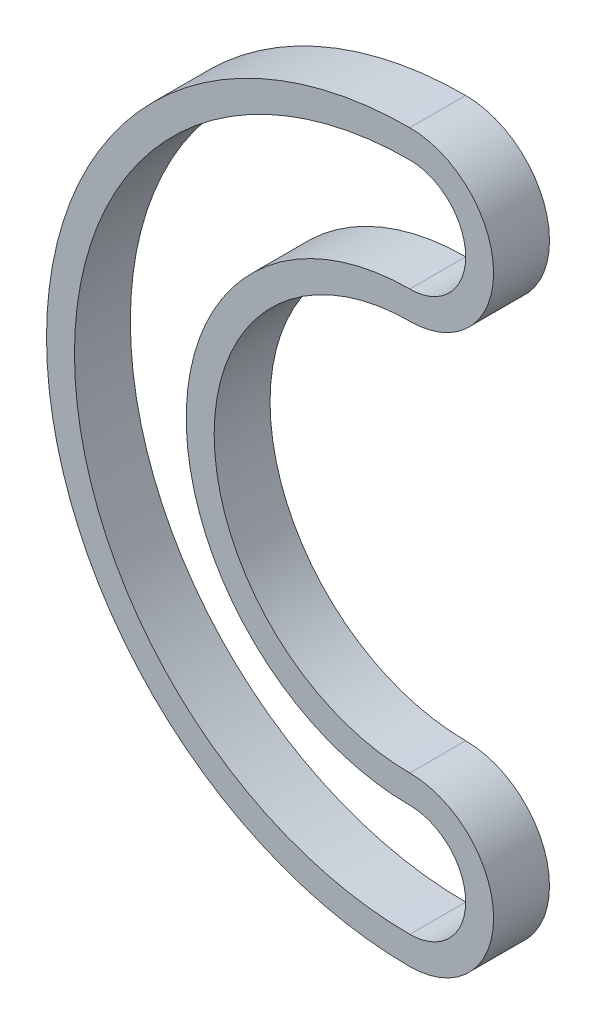
ISO-10303-21;
HEADER;
FILE_DESCRIPTION(('STEP AP214'),'2;1');
FILE_NAME('part.step','',(''),(''),'','','');
FILE_SCHEMA(('AUTOMOTIVE_DESIGN { 1 0 10303 214 1 1 1 1 }'));
ENDSEC;
DATA;
#1=APPLICATION_CONTEXT('core data for automotive mechanical design processes');
#2=APPLICATION_PROTOCOL_DEFINITION('international standard','automotive_design',2000,#1);
#3=PRODUCT_CONTEXT('',#1,'mechanical');
#4=PRODUCT('Part','Part','',(#3));
#5=PRODUCT_RELATED_PRODUCT_CATEGORY('part','',(#4));
#6=PRODUCT_DEFINITION_FORMATION('','',#4);
#7=PRODUCT_DEFINITION_CONTEXT('part definition',#1,'design');
#8=PRODUCT_DEFINITION('design','',#6,#7);
#9=PRODUCT_DEFINITION_SHAPE('','',#8);
#10=(LENGTH_UNIT() NAMED_UNIT(*) SI_UNIT(.MILLI.,.METRE.));
#11=(NAMED_UNIT(*) PLANE_ANGLE_UNIT() SI_UNIT($,.RADIAN.));
#12=(NAMED_UNIT(*) SI_UNIT($,.STERADIAN.) SOLID_ANGLE_UNIT());
#13=UNCERTAINTY_MEASURE_WITH_UNIT(LENGTH_MEASURE(1.E-05),#10,'distance_accuracy_value','');
#14=(GEOMETRIC_REPRESENTATION_CONTEXT(3) GLOBAL_UNCERTAINTY_ASSIGNED_CONTEXT((#13)) GLOBAL_UNIT_ASSIGNED_CONTEXT((#10,
#11,#12)) REPRESENTATION_CONTEXT('',''));
#15=CARTESIAN_POINT('',(0.,0.,0.));
#16=DIRECTION('',(0.,0.,1.));
#17=DIRECTION('',(1.,0.,0.));
#18=AXIS2_PLACEMENT_3D('',#15,#16,#17);
#19=CARTESIAN_POINT('',(-0.975265744954113,10.0766721729251,0.5));
#20=DIRECTION('',(0.,0.,1.));
#21=DIRECTION('',(1.,0.,0.));
#22=AXIS2_PLACEMENT_3D('',#19,#20,#21);
#23=PLANE('',#22);
#24=CARTESIAN_POINT('',(-0.975265744954113,12.5766721729251,0.5));
#25=DIRECTION('',(0.,0.,1.));
#26=DIRECTION('',(1.,0.,0.));
#27=AXIS2_PLACEMENT_3D('',#24,#25,#26);
#28=CIRCLE('',#27,1.5);
#29=CARTESIAN_POINT('',(-0.975265744954113,11.0766721729251,0.5));
#30=VERTEX_POINT('',#29);
#31=CARTESIAN_POINT('',(-0.975265744954113,14.0766721729251,0.5));
#32=VERTEX_POINT('',#31);
#33=EDGE_CURVE('E140',#30,#32,#28,.T.);
#34=ORIENTED_EDGE('',*,*,#33,.T.);
#35=CARTESIAN_POINT('',(-0.975265744954112,7.57667217292513,0.5));
#36=DIRECTION('',(0.,0.,1.));
#37=DIRECTION('',(1.,0.,0.));
#38=AXIS2_PLACEMENT_3D('',#35,#36,#37);
#39=CIRCLE('',#38,6.5);
#40=CARTESIAN_POINT('',(-0.975265744954112,1.07667217292513,0.5));
#41=VERTEX_POINT('',#40);
#42=EDGE_CURVE('E143',#32,#41,#39,.T.);
#43=ORIENTED_EDGE('',*,*,#42,.T.);
#44=CARTESIAN_POINT('',(-0.975265744954112,2.57667217292513,0.5));
#45=DIRECTION('',(0.,0.,1.));
#46=DIRECTION('',(1.,0.,0.));
#47=AXIS2_PLACEMENT_3D('',#44,#45,#46);
#48=CIRCLE('',#47,1.5);
#49=CARTESIAN_POINT('',(-0.975265744954113,4.07667217292513,0.5));
#50=VERTEX_POINT('',#49);
#51=EDGE_CURVE('E146',#41,#50,#48,.T.);
#52=ORIENTED_EDGE('',*,*,#51,.T.);
#53=CARTESIAN_POINT('',(-0.975265744954112,7.57667217292513,0.5));
#54=DIRECTION('',(0.,0.,-1.));
#55=DIRECTION('',(1.,0.,0.));
#56=AXIS2_PLACEMENT_3D('',#53,#54,#55);
#57=CIRCLE('',#56,3.5);
#58=EDGE_CURVE('E148',#50,#30,#57,.T.);
#59=ORIENTED_EDGE('',*,*,#58,.T.);
#60=EDGE_LOOP('',(#34,#43,#52,#59));
#61=FACE_BOUND('',#60,.T.);
#62=CARTESIAN_POINT('',(-0.975265744954112,7.57667217292513,0.5));
#63=DIRECTION('',(0.,0.,1.));
#64=DIRECTION('',(1.,0.,0.));
#65=AXIS2_PLACEMENT_3D('',#62,#63,#64);
#66=CIRCLE('',#65,6.);
#67=CARTESIAN_POINT('',(-0.975265744954113,13.5766721729251,0.5));
#68=VERTEX_POINT('',#67);
#69=CARTESIAN_POINT('',(-0.975265744954112,1.57667217292513,0.5));
#70=VERTEX_POINT('',#69);
#71=EDGE_CURVE('E112',#68,#70,#66,.T.);
#72=ORIENTED_EDGE('',*,*,#71,.F.);
#73=CARTESIAN_POINT('',(-0.975265744954113,12.5766721729251,0.5));
#74=DIRECTION('',(0.,0.,1.));
#75=DIRECTION('',(1.,0.,0.));
#76=AXIS2_PLACEMENT_3D('',#73,#74,#75);
#77=CIRCLE('',#76,1.);
#78=CARTESIAN_POINT('',(-0.975265744954113,11.5766721729251,0.5));
#79=VERTEX_POINT('',#78);
#80=EDGE_CURVE('E104',#79,#68,#77,.T.);
#81=ORIENTED_EDGE('',*,*,#80,.F.);
#82=CARTESIAN_POINT('',(-0.975265744954112,7.57667217292513,0.5));
#83=DIRECTION('',(0.,0.,-1.));
#84=DIRECTION('',(1.,0.,0.));
#85=AXIS2_PLACEMENT_3D('',#82,#83,#84);
#86=CIRCLE('',#85,4.);
#87=CARTESIAN_POINT('',(-0.975265744954113,3.57667217292513,0.5));
#88=VERTEX_POINT('',#87);
#89=EDGE_CURVE('E126',#88,#79,#86,.T.);
#90=ORIENTED_EDGE('',*,*,#89,.F.);
#91=CARTESIAN_POINT('',(-0.975265744954112,2.57667217292513,0.5));
#92=DIRECTION('',(0.,0.,1.));
#93=DIRECTION('',(1.,0.,0.));
#94=AXIS2_PLACEMENT_3D('',#91,#92,#93);
#95=CIRCLE('',#94,1.);
#96=EDGE_CURVE('E124',#70,#88,#95,.T.);
#97=ORIENTED_EDGE('',*,*,#96,.F.);
#98=EDGE_LOOP('',(#72,#81,#90,#97));
#99=FACE_BOUND('',#98,.T.);
#100=ADVANCED_FACE('F39',(#61,#99),#23,.T.);
#101=CARTESIAN_POINT('',(-0.975265744954113,10.0766721729251,-0.5));
#102=DIRECTION('',(0.,0.,1.));
#103=DIRECTION('',(1.,0.,0.));
#104=AXIS2_PLACEMENT_3D('',#101,#102,#103);
#105=PLANE('',#104);
#106=CARTESIAN_POINT('',(-0.975265744954113,12.5766721729251,-0.5));
#107=DIRECTION('',(0.,0.,1.));
#108=DIRECTION('',(1.,0.,0.));
#109=AXIS2_PLACEMENT_3D('',#106,#107,#108);
#110=CIRCLE('',#109,1.5);
#111=CARTESIAN_POINT('',(-0.975265744954113,11.0766721729251,-0.5));
#112=VERTEX_POINT('',#111);
#113=CARTESIAN_POINT('',(-0.975265744954113,14.0766721729251,-0.5));
#114=VERTEX_POINT('',#113);
#115=EDGE_CURVE('E120',#112,#114,#110,.T.);
#116=ORIENTED_EDGE('',*,*,#115,.F.);
#117=CARTESIAN_POINT('',(-0.975265744954112,7.57667217292513,-0.5));
#118=DIRECTION('',(0.,0.,-1.));
#119=DIRECTION('',(1.,0.,0.));
#120=AXIS2_PLACEMENT_3D('',#117,#118,#119);
#121=CIRCLE('',#120,3.5);
#122=CARTESIAN_POINT('',(-0.975265744954113,4.07667217292513,-0.5));
#123=VERTEX_POINT('',#122);
#124=EDGE_CURVE('E144',#123,#112,#121,.T.);
#125=ORIENTED_EDGE('',*,*,#124,.F.);
#126=CARTESIAN_POINT('',(-0.975265744954112,2.57667217292513,-0.5));
#127=DIRECTION('',(0.,0.,1.));
#128=DIRECTION('',(1.,0.,0.));
#129=AXIS2_PLACEMENT_3D('',#126,#127,#128);
#130=CIRCLE('',#129,1.5);
#131=CARTESIAN_POINT('',(-0.975265744954112,1.07667217292513,-0.5));
#132=VERTEX_POINT('',#131);
#133=EDGE_CURVE('E155',#132,#123,#130,.T.);
#134=ORIENTED_EDGE('',*,*,#133,.F.);
#135=CARTESIAN_POINT('',(-0.975265744954112,7.57667217292513,-0.5));
#136=DIRECTION('',(0.,0.,1.));
#137=DIRECTION('',(1.,0.,0.));
#138=AXIS2_PLACEMENT_3D('',#135,#136,#137);
#139=CIRCLE('',#138,6.5);
#140=EDGE_CURVE('E153',#114,#132,#139,.T.);
#141=ORIENTED_EDGE('',*,*,#140,.F.);
#142=EDGE_LOOP('',(#116,#125,#134,#141));
#143=FACE_BOUND('',#142,.T.);
#144=CARTESIAN_POINT('',(-0.975265744954113,12.5766721729251,-0.5));
#145=DIRECTION('',(0.,0.,1.));
#146=DIRECTION('',(1.,0.,0.));
#147=AXIS2_PLACEMENT_3D('',#144,#145,#146);
#148=CIRCLE('',#147,1.);
#149=CARTESIAN_POINT('',(-0.975265744954113,11.5766721729251,-0.5));
#150=VERTEX_POINT('',#149);
#151=CARTESIAN_POINT('',(-0.975265744954113,13.5766721729251,-0.5));
#152=VERTEX_POINT('',#151);
#153=EDGE_CURVE('E62',#150,#152,#148,.T.);
#154=ORIENTED_EDGE('',*,*,#153,.T.);
#155=CARTESIAN_POINT('',(-0.975265744954112,7.57667217292513,-0.5));
#156=DIRECTION('',(0.,0.,1.));
#157=DIRECTION('',(1.,0.,0.));
#158=AXIS2_PLACEMENT_3D('',#155,#156,#157);
#159=CIRCLE('',#158,6.);
#160=CARTESIAN_POINT('',(-0.975265744954112,1.57667217292513,-0.5));
#161=VERTEX_POINT('',#160);
#162=EDGE_CURVE('E119',#152,#161,#159,.T.);
#163=ORIENTED_EDGE('',*,*,#162,.T.);
#164=CARTESIAN_POINT('',(-0.975265744954112,2.57667217292513,-0.5));
#165=DIRECTION('',(0.,0.,1.));
#166=DIRECTION('',(1.,0.,0.));
#167=AXIS2_PLACEMENT_3D('',#164,#165,#166);
#168=CIRCLE('',#167,1.);
#169=CARTESIAN_POINT('',(-0.975265744954113,3.57667217292513,-0.5));
#170=VERTEX_POINT('',#169);
#171=EDGE_CURVE('E132',#161,#170,#168,.T.);
#172=ORIENTED_EDGE('',*,*,#171,.T.);
#173=CARTESIAN_POINT('',(-0.975265744954112,7.57667217292513,-0.5));
#174=DIRECTION('',(0.,0.,-1.));
#175=DIRECTION('',(1.,0.,0.));
#176=AXIS2_PLACEMENT_3D('',#173,#174,#175);
#177=CIRCLE('',#176,4.);
#178=EDGE_CURVE('E113',#170,#150,#177,.T.);
#179=ORIENTED_EDGE('',*,*,#178,.T.);
#180=EDGE_LOOP('',(#154,#163,#172,#179));
#181=FACE_BOUND('',#180,.T.);
#182=ADVANCED_FACE('F173',(#143,#181),#105,.F.);
#183=CARTESIAN_POINT('',(-0.975265744954113,12.5766721729251,0.5));
#184=DIRECTION('',(0.,0.,-1.));
#185=DIRECTION('',(-1.,0.,0.));
#186=AXIS2_PLACEMENT_3D('',#183,#184,#185);
#187=CYLINDRICAL_SURFACE('',#186,1.5);
#188=ORIENTED_EDGE('',*,*,#115,.T.);
#189=DIRECTION('',(0.,0.,-1.));
#190=VECTOR('',#189,1.);
#191=CARTESIAN_POINT('',(-0.975265744954113,14.0766721729251,0.5));
#192=LINE('',#191,#190);
#193=EDGE_CURVE('E11',#32,#114,#192,.T.);
#194=ORIENTED_EDGE('',*,*,#193,.F.);
#195=ORIENTED_EDGE('',*,*,#33,.F.);
#196=DIRECTION('',(0.,0.,-1.));
#197=VECTOR('',#196,1.);
#198=CARTESIAN_POINT('',(-0.975265744954113,11.0766721729251,0.5));
#199=LINE('',#198,#197);
#200=EDGE_CURVE('E150',#30,#112,#199,.T.);
#201=ORIENTED_EDGE('',*,*,#200,.T.);
#202=EDGE_LOOP('',(#188,#194,#195,#201));
#203=FACE_BOUND('',#202,.T.);
#204=ADVANCED_FACE('F41',(#203),#187,.T.);
#205=CARTESIAN_POINT('',(-0.975265744954112,7.57667217292513,0.5));
#206=DIRECTION('',(0.,0.,-1.));
#207=DIRECTION('',(-1.,0.,0.));
#208=AXIS2_PLACEMENT_3D('',#205,#206,#207);
#209=CYLINDRICAL_SURFACE('',#208,6.5);
#210=ORIENTED_EDGE('',*,*,#140,.T.);
#211=DIRECTION('',(0.,0.,-1.));
#212=VECTOR('',#211,1.);
#213=CARTESIAN_POINT('',(-0.975265744954112,1.07667217292513,0.5));
#214=LINE('',#213,#212);
#215=EDGE_CURVE('E47',#41,#132,#214,.T.);
#216=ORIENTED_EDGE('',*,*,#215,.F.);
#217=ORIENTED_EDGE('',*,*,#42,.F.);
#218=ORIENTED_EDGE('',*,*,#193,.T.);
#219=EDGE_LOOP('',(#210,#216,#217,#218));
#220=FACE_BOUND('',#219,.T.);
#221=ADVANCED_FACE('F183',(#220),#209,.T.);
#222=CARTESIAN_POINT('',(-0.975265744954112,2.57667217292513,0.5));
#223=DIRECTION('',(0.,0.,-1.));
#224=DIRECTION('',(-1.,0.,0.));
#225=AXIS2_PLACEMENT_3D('',#222,#223,#224);
#226=CYLINDRICAL_SURFACE('',#225,1.5);
#227=ORIENTED_EDGE('',*,*,#133,.T.);
#228=DIRECTION('',(0.,0.,-1.));
#229=VECTOR('',#228,1.);
#230=CARTESIAN_POINT('',(-0.975265744954113,4.07667217292513,0.5));
#231=LINE('',#230,#229);
#232=EDGE_CURVE('E160',#50,#123,#231,.T.);
#233=ORIENTED_EDGE('',*,*,#232,.F.);
#234=ORIENTED_EDGE('',*,*,#51,.F.);
#235=ORIENTED_EDGE('',*,*,#215,.T.);
#236=EDGE_LOOP('',(#227,#233,#234,#235));
#237=FACE_BOUND('',#236,.T.);
#238=ADVANCED_FACE('F167',(#237),#226,.T.);
#239=CARTESIAN_POINT('',(-0.975265744954112,7.57667217292513,0.5));
#240=DIRECTION('',(0.,0.,-1.));
#241=DIRECTION('',(-1.,0.,0.));
#242=AXIS2_PLACEMENT_3D('',#239,#240,#241);
#243=CYLINDRICAL_SURFACE('',#242,3.5);
#244=ORIENTED_EDGE('',*,*,#124,.T.);
#245=ORIENTED_EDGE('',*,*,#200,.F.);
#246=ORIENTED_EDGE('',*,*,#58,.F.);
#247=ORIENTED_EDGE('',*,*,#232,.T.);
#248=EDGE_LOOP('',(#244,#245,#246,#247));
#249=FACE_BOUND('',#248,.T.);
#250=ADVANCED_FACE('F177',(#249),#243,.F.);
#251=CARTESIAN_POINT('',(-0.975265744954113,12.5766721729251,0.5));
#252=DIRECTION('',(0.,0.,-1.));
#253=DIRECTION('',(-1.,0.,0.));
#254=AXIS2_PLACEMENT_3D('',#251,#252,#253);
#255=CYLINDRICAL_SURFACE('',#254,1.);
#256=ORIENTED_EDGE('',*,*,#153,.F.);
#257=DIRECTION('',(0.,0.,-1.));
#258=VECTOR('',#257,1.);
#259=CARTESIAN_POINT('',(-0.975265744954113,11.5766721729251,0.5));
#260=LINE('',#259,#258);
#261=EDGE_CURVE('E108',#79,#150,#260,.T.);
#262=ORIENTED_EDGE('',*,*,#261,.F.);
#263=ORIENTED_EDGE('',*,*,#80,.T.);
#264=DIRECTION('',(0.,0.,-1.));
#265=VECTOR('',#264,1.);
#266=CARTESIAN_POINT('',(-0.975265744954113,13.5766721729251,0.5));
#267=LINE('',#266,#265);
#268=EDGE_CURVE('E107',#68,#152,#267,.T.);
#269=ORIENTED_EDGE('',*,*,#268,.T.);
#270=EDGE_LOOP('',(#256,#262,#263,#269));
#271=FACE_BOUND('',#270,.T.);
#272=ADVANCED_FACE('F106',(#271),#255,.F.);
#273=CARTESIAN_POINT('',(-0.975265744954112,7.57667217292513,0.5));
#274=DIRECTION('',(0.,0.,-1.));
#275=DIRECTION('',(-1.,0.,0.));
#276=AXIS2_PLACEMENT_3D('',#273,#274,#275);
#277=CYLINDRICAL_SURFACE('',#276,6.);
#278=ORIENTED_EDGE('',*,*,#162,.F.);
#279=ORIENTED_EDGE('',*,*,#268,.F.);
#280=ORIENTED_EDGE('',*,*,#71,.T.);
#281=DIRECTION('',(0.,0.,-1.));
#282=VECTOR('',#281,1.);
#283=CARTESIAN_POINT('',(-0.975265744954112,1.57667217292513,0.5));
#284=LINE('',#283,#282);
#285=EDGE_CURVE('E121',#70,#161,#284,.T.);
#286=ORIENTED_EDGE('',*,*,#285,.T.);
#287=EDGE_LOOP('',(#278,#279,#280,#286));
#288=FACE_BOUND('',#287,.T.);
#289=ADVANCED_FACE('F116',(#288),#277,.F.);
#290=CARTESIAN_POINT('',(-0.975265744954112,2.57667217292513,0.5));
#291=DIRECTION('',(0.,0.,-1.));
#292=DIRECTION('',(-1.,0.,0.));
#293=AXIS2_PLACEMENT_3D('',#290,#291,#292);
#294=CYLINDRICAL_SURFACE('',#293,1.);
#295=ORIENTED_EDGE('',*,*,#171,.F.);
#296=ORIENTED_EDGE('',*,*,#285,.F.);
#297=ORIENTED_EDGE('',*,*,#96,.T.);
#298=DIRECTION('',(0.,0.,-1.));
#299=VECTOR('',#298,1.);
#300=CARTESIAN_POINT('',(-0.975265744954113,3.57667217292513,0.5));
#301=LINE('',#300,#299);
#302=EDGE_CURVE('E54',#88,#170,#301,.T.);
#303=ORIENTED_EDGE('',*,*,#302,.T.);
#304=EDGE_LOOP('',(#295,#296,#297,#303));
#305=FACE_BOUND('',#304,.T.);
#306=ADVANCED_FACE('F206',(#305),#294,.F.);
#307=CARTESIAN_POINT('',(-0.975265744954112,7.57667217292513,0.5));
#308=DIRECTION('',(0.,0.,-1.));
#309=DIRECTION('',(-1.,0.,0.));
#310=AXIS2_PLACEMENT_3D('',#307,#308,#309);
#311=CYLINDRICAL_SURFACE('',#310,4.);
#312=ORIENTED_EDGE('',*,*,#178,.F.);
#313=ORIENTED_EDGE('',*,*,#302,.F.);
#314=ORIENTED_EDGE('',*,*,#89,.T.);
#315=ORIENTED_EDGE('',*,*,#261,.T.);
#316=EDGE_LOOP('',(#312,#313,#314,#315));
#317=FACE_BOUND('',#316,.T.);
#318=ADVANCED_FACE('F210',(#317),#311,.T.);
#319=CLOSED_SHELL('',(#100,#182,#204,#221,#238,#250,#272,#289,#306,#318));
#320=MANIFOLD_SOLID_BREP('B2',#319);
#321=ADVANCED_BREP_SHAPE_REPRESENTATION('',(#18,#320),#14);
#322=SHAPE_DEFINITION_REPRESENTATION(#9,#321);
ENDSEC;
END-ISO-10303-21;
